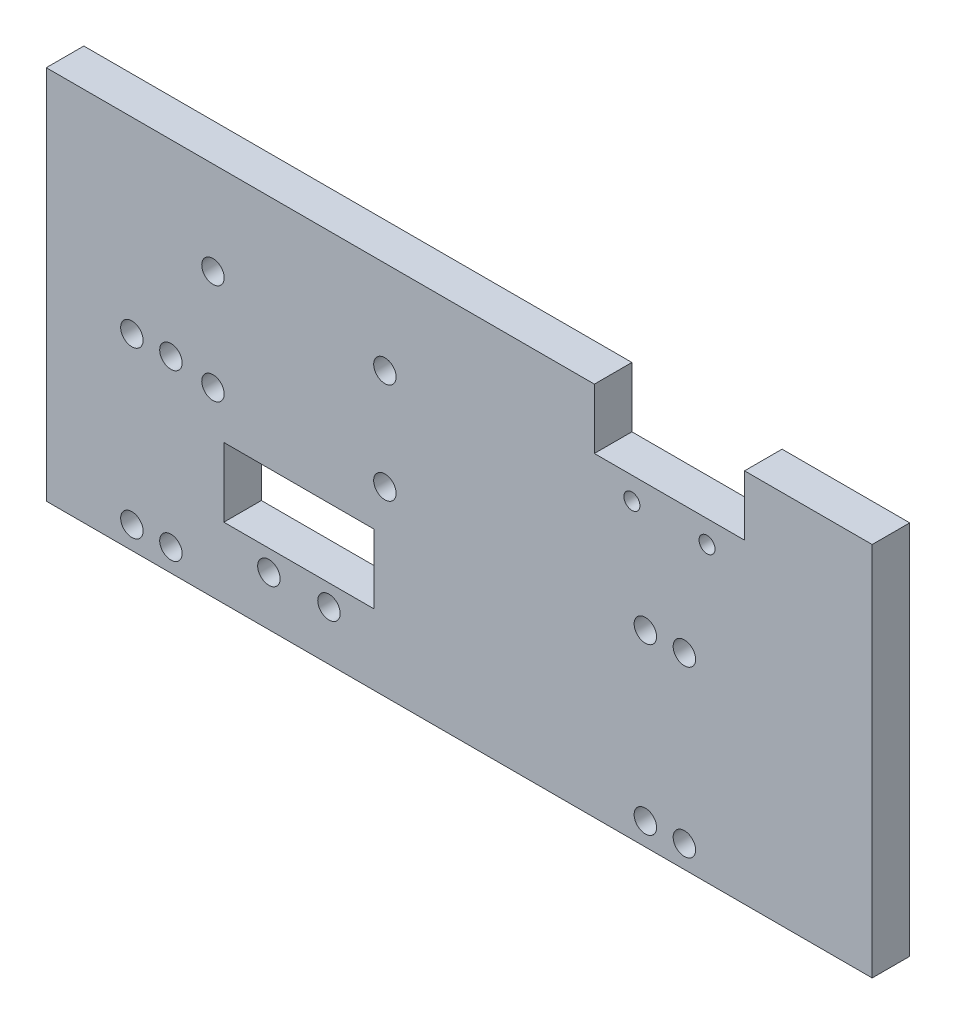
ISO-10303-21;
HEADER;
FILE_DESCRIPTION(('STEP AP214'),'2;1');
FILE_NAME('part.step','',(''),(''),'','','');
FILE_SCHEMA(('AUTOMOTIVE_DESIGN { 1 0 10303 214 1 1 1 1 }'));
ENDSEC;
DATA;
#1=APPLICATION_CONTEXT('core data for automotive mechanical design processes');
#2=APPLICATION_PROTOCOL_DEFINITION('international standard','automotive_design',2000,#1);
#3=PRODUCT_CONTEXT('',#1,'mechanical');
#4=PRODUCT('Part','Part','',(#3));
#5=PRODUCT_RELATED_PRODUCT_CATEGORY('part','',(#4));
#6=PRODUCT_DEFINITION_FORMATION('','',#4);
#7=PRODUCT_DEFINITION_CONTEXT('part definition',#1,'design');
#8=PRODUCT_DEFINITION('design','',#6,#7);
#9=PRODUCT_DEFINITION_SHAPE('','',#8);
#10=(LENGTH_UNIT() NAMED_UNIT(*) SI_UNIT(.MILLI.,.METRE.));
#11=(NAMED_UNIT(*) PLANE_ANGLE_UNIT() SI_UNIT($,.RADIAN.));
#12=(NAMED_UNIT(*) SI_UNIT($,.STERADIAN.) SOLID_ANGLE_UNIT());
#13=UNCERTAINTY_MEASURE_WITH_UNIT(LENGTH_MEASURE(1.E-05),#10,'distance_accuracy_value','');
#14=(GEOMETRIC_REPRESENTATION_CONTEXT(3) GLOBAL_UNCERTAINTY_ASSIGNED_CONTEXT((#13)) GLOBAL_UNIT_ASSIGNED_CONTEXT((#10,
#11,#12)) REPRESENTATION_CONTEXT('',''));
#15=CARTESIAN_POINT('',(0.,0.,0.));
#16=DIRECTION('',(0.,0.,1.));
#17=DIRECTION('',(1.,0.,0.));
#18=AXIS2_PLACEMENT_3D('',#15,#16,#17);
#19=CARTESIAN_POINT('',(127.,31.75,6.35));
#20=DIRECTION('',(0.,-1.,0.));
#21=DIRECTION('',(1.,0.,0.));
#22=AXIS2_PLACEMENT_3D('',#19,#20,#21);
#23=PLANE('',#22);
#24=DIRECTION('',(-1.,0.,0.));
#25=VECTOR('',#24,1.);
#26=CARTESIAN_POINT('',(127.,31.75,6.35));
#27=LINE('',#26,#25);
#28=CARTESIAN_POINT('',(-34.29,31.75,6.35));
#29=VERTEX_POINT('',#28);
#30=CARTESIAN_POINT('',(-127.,31.75,6.35));
#31=VERTEX_POINT('',#30);
#32=EDGE_CURVE('E263',#29,#31,#27,.T.);
#33=ORIENTED_EDGE('',*,*,#32,.F.);
#34=DIRECTION('',(0.,0.,-1.));
#35=VECTOR('',#34,1.);
#36=CARTESIAN_POINT('',(-34.29,31.75,6.35));
#37=LINE('',#36,#35);
#38=CARTESIAN_POINT('',(-34.29,31.75,0.));
#39=VERTEX_POINT('',#38);
#40=EDGE_CURVE('E42',#29,#39,#37,.T.);
#41=ORIENTED_EDGE('',*,*,#40,.T.);
#42=DIRECTION('',(-1.,0.,0.));
#43=VECTOR('',#42,1.);
#44=CARTESIAN_POINT('',(127.,31.75,0.));
#45=LINE('',#44,#43);
#46=CARTESIAN_POINT('',(-127.,31.75,0.));
#47=VERTEX_POINT('',#46);
#48=EDGE_CURVE('E272',#39,#47,#45,.T.);
#49=ORIENTED_EDGE('',*,*,#48,.T.);
#50=DIRECTION('',(0.,0.,-1.));
#51=VECTOR('',#50,1.);
#52=CARTESIAN_POINT('',(-127.,31.75,6.35));
#53=LINE('',#52,#51);
#54=EDGE_CURVE('E266',#31,#47,#53,.T.);
#55=ORIENTED_EDGE('',*,*,#54,.F.);
#56=EDGE_LOOP('',(#33,#41,#49,#55));
#57=FACE_BOUND('',#56,.T.);
#58=ADVANCED_FACE('F33',(#57),#23,.F.);
#59=CARTESIAN_POINT('',(0.,0.,6.35));
#60=DIRECTION('',(0.,0.,1.));
#61=DIRECTION('',(1.,0.,0.));
#62=AXIS2_PLACEMENT_3D('',#59,#60,#61);
#63=PLANE('',#62);
#64=CARTESIAN_POINT('',(-25.6687974823819,0.,6.35));
#65=DIRECTION('',(0.,0.,1.));
#66=DIRECTION('',(1.,0.,0.));
#67=AXIS2_PLACEMENT_3D('',#64,#65,#66);
#68=CIRCLE('',#67,1.89865);
#69=CARTESIAN_POINT('',(-23.7701474823819,0.,6.35));
#70=VERTEX_POINT('',#69);
#71=EDGE_CURVE('E299',#70,#70,#68,.T.);
#72=ORIENTED_EDGE('',*,*,#71,.F.);
#73=EDGE_LOOP('',(#72));
#74=FACE_BOUND('',#73,.T.);
#75=CARTESIAN_POINT('',(-19.0647974823819,0.,6.35));
#76=DIRECTION('',(0.,0.,1.));
#77=DIRECTION('',(1.,0.,0.));
#78=AXIS2_PLACEMENT_3D('',#75,#76,#77);
#79=CIRCLE('',#78,1.89865);
#80=CARTESIAN_POINT('',(-17.1661474823819,0.,6.35));
#81=VERTEX_POINT('',#80);
#82=EDGE_CURVE('E289',#81,#81,#79,.T.);
#83=ORIENTED_EDGE('',*,*,#82,.F.);
#84=EDGE_LOOP('',(#83));
#85=FACE_BOUND('',#84,.T.);
#86=CARTESIAN_POINT('',(-25.6687974823819,-27.94,6.35));
#87=DIRECTION('',(0.,0.,1.));
#88=DIRECTION('',(1.,0.,0.));
#89=AXIS2_PLACEMENT_3D('',#86,#87,#88);
#90=CIRCLE('',#89,1.89865);
#91=CARTESIAN_POINT('',(-23.7701474823819,-27.94,6.35));
#92=VERTEX_POINT('',#91);
#93=EDGE_CURVE('E286',#92,#92,#90,.T.);
#94=ORIENTED_EDGE('',*,*,#93,.F.);
#95=EDGE_LOOP('',(#94));
#96=FACE_BOUND('',#95,.T.);
#97=CARTESIAN_POINT('',(-19.0647974823819,-27.94,6.35));
#98=DIRECTION('',(0.,0.,1.));
#99=DIRECTION('',(1.,0.,0.));
#100=AXIS2_PLACEMENT_3D('',#97,#98,#99);
#101=CIRCLE('',#100,1.89865);
#102=CARTESIAN_POINT('',(-17.1661474823819,-27.94,6.35));
#103=VERTEX_POINT('',#102);
#104=EDGE_CURVE('E285',#103,#103,#101,.T.);
#105=ORIENTED_EDGE('',*,*,#104,.F.);
#106=EDGE_LOOP('',(#105));
#107=FACE_BOUND('',#106,.T.);
#108=CARTESIAN_POINT('',(-27.94,17.78,6.35));
#109=DIRECTION('',(0.,0.,1.));
#110=DIRECTION('',(1.,0.,0.));
#111=AXIS2_PLACEMENT_3D('',#108,#109,#110);
#112=CIRCLE('',#111,1.35254999999999);
#113=CARTESIAN_POINT('',(-26.58745,17.78,6.35));
#114=VERTEX_POINT('',#113);
#115=EDGE_CURVE('E307',#114,#114,#112,.T.);
#116=ORIENTED_EDGE('',*,*,#115,.F.);
#117=EDGE_LOOP('',(#116));
#118=FACE_BOUND('',#117,.T.);
#119=CARTESIAN_POINT('',(-15.24,17.78,6.35));
#120=DIRECTION('',(0.,0.,1.));
#121=DIRECTION('',(1.,0.,0.));
#122=AXIS2_PLACEMENT_3D('',#119,#120,#121);
#123=CIRCLE('',#122,1.35254999999999);
#124=CARTESIAN_POINT('',(-13.88745,17.78,6.35));
#125=VERTEX_POINT('',#124);
#126=EDGE_CURVE('E313',#125,#125,#123,.T.);
#127=ORIENTED_EDGE('',*,*,#126,.F.);
#128=EDGE_LOOP('',(#127));
#129=FACE_BOUND('',#128,.T.);
#130=DIRECTION('',(0.,-1.,0.));
#131=VECTOR('',#130,1.);
#132=CARTESIAN_POINT('',(-34.29,31.75,6.35));
#133=LINE('',#132,#131);
#134=CARTESIAN_POINT('',(-34.29,21.59,6.35));
#135=VERTEX_POINT('',#134);
#136=EDGE_CURVE('E135',#29,#135,#133,.T.);
#137=ORIENTED_EDGE('',*,*,#136,.F.);
#138=ORIENTED_EDGE('',*,*,#32,.T.);
#139=DIRECTION('',(0.,-1.,0.));
#140=VECTOR('',#139,1.);
#141=CARTESIAN_POINT('',(-127.,-31.75,6.35));
#142=LINE('',#141,#140);
#143=CARTESIAN_POINT('',(-127.,-31.75,6.35));
#144=VERTEX_POINT('',#143);
#145=EDGE_CURVE('E256',#31,#144,#142,.T.);
#146=ORIENTED_EDGE('',*,*,#145,.T.);
#147=DIRECTION('',(1.,0.,0.));
#148=VECTOR('',#147,1.);
#149=CARTESIAN_POINT('',(127.,-31.75,6.35));
#150=LINE('',#149,#148);
#151=CARTESIAN_POINT('',(12.7,-31.75,6.35));
#152=VERTEX_POINT('',#151);
#153=EDGE_CURVE('E259',#144,#152,#150,.T.);
#154=ORIENTED_EDGE('',*,*,#153,.T.);
#155=DIRECTION('',(0.,-1.,0.));
#156=VECTOR('',#155,1.);
#157=CARTESIAN_POINT('',(12.7,31.75,6.35));
#158=LINE('',#157,#156);
#159=CARTESIAN_POINT('',(12.7,31.75,6.35));
#160=VERTEX_POINT('',#159);
#161=EDGE_CURVE('E155',#160,#152,#158,.T.);
#162=ORIENTED_EDGE('',*,*,#161,.F.);
#163=CARTESIAN_POINT('',(-8.88999999999998,31.75,6.35));
#164=VERTEX_POINT('',#163);
#165=EDGE_CURVE('E264',#160,#164,#27,.T.);
#166=ORIENTED_EDGE('',*,*,#165,.T.);
#167=DIRECTION('',(0.,1.,0.));
#168=VECTOR('',#167,1.);
#169=CARTESIAN_POINT('',(-8.88999999999997,31.75,6.35));
#170=LINE('',#169,#168);
#171=CARTESIAN_POINT('',(-8.88999999999997,21.59,6.35));
#172=VERTEX_POINT('',#171);
#173=EDGE_CURVE('E50',#172,#164,#170,.T.);
#174=ORIENTED_EDGE('',*,*,#173,.F.);
#175=DIRECTION('',(1.,0.,0.));
#176=VECTOR('',#175,1.);
#177=CARTESIAN_POINT('',(-34.29,21.59,6.35));
#178=LINE('',#177,#176);
#179=EDGE_CURVE('E129',#135,#172,#178,.T.);
#180=ORIENTED_EDGE('',*,*,#179,.F.);
#181=EDGE_LOOP('',(#137,#138,#146,#154,#162,#166,#174,#180));
#182=FACE_BOUND('',#181,.T.);
#183=CARTESIAN_POINT('',(-79.1845,-23.35276,6.35));
#184=DIRECTION('',(0.,0.,1.));
#185=DIRECTION('',(1.,0.,0.));
#186=AXIS2_PLACEMENT_3D('',#183,#184,#185);
#187=CIRCLE('',#186,1.89864999999999);
#188=CARTESIAN_POINT('',(-77.28585,-23.35276,6.35));
#189=VERTEX_POINT('',#188);
#190=EDGE_CURVE('E166',#189,#189,#187,.T.);
#191=ORIENTED_EDGE('',*,*,#190,.F.);
#192=EDGE_LOOP('',(#191));
#193=FACE_BOUND('',#192,.T.);
#194=CARTESIAN_POINT('',(-89.3445,-23.35276,6.35));
#195=DIRECTION('',(0.,0.,1.));
#196=DIRECTION('',(1.,0.,0.));
#197=AXIS2_PLACEMENT_3D('',#194,#195,#196);
#198=CIRCLE('',#197,1.89864999999999);
#199=CARTESIAN_POINT('',(-87.44585,-23.35276,6.35));
#200=VERTEX_POINT('',#199);
#201=EDGE_CURVE('E172',#200,#200,#198,.T.);
#202=ORIENTED_EDGE('',*,*,#201,.F.);
#203=EDGE_LOOP('',(#202));
#204=FACE_BOUND('',#203,.T.);
#205=CARTESIAN_POINT('',(-69.723,16.002,6.35));
#206=DIRECTION('',(0.,0.,1.));
#207=DIRECTION('',(1.,0.,0.));
#208=AXIS2_PLACEMENT_3D('',#205,#206,#207);
#209=CIRCLE('',#208,1.89865);
#210=CARTESIAN_POINT('',(-67.82435,16.002,6.35));
#211=VERTEX_POINT('',#210);
#212=EDGE_CURVE('E178',#211,#211,#209,.T.);
#213=ORIENTED_EDGE('',*,*,#212,.F.);
#214=EDGE_LOOP('',(#213));
#215=FACE_BOUND('',#214,.T.);
#216=CARTESIAN_POINT('',(-98.806,16.002,6.35));
#217=DIRECTION('',(0.,0.,1.));
#218=DIRECTION('',(1.,0.,0.));
#219=AXIS2_PLACEMENT_3D('',#216,#217,#218);
#220=CIRCLE('',#219,1.89865);
#221=CARTESIAN_POINT('',(-96.90735,16.002,6.35));
#222=VERTEX_POINT('',#221);
#223=EDGE_CURVE('E184',#222,#222,#220,.T.);
#224=ORIENTED_EDGE('',*,*,#223,.F.);
#225=EDGE_LOOP('',(#224));
#226=FACE_BOUND('',#225,.T.);
#227=CARTESIAN_POINT('',(-98.806,-1.01600000000002,6.35));
#228=DIRECTION('',(0.,0.,1.));
#229=DIRECTION('',(1.,0.,0.));
#230=AXIS2_PLACEMENT_3D('',#227,#228,#229);
#231=CIRCLE('',#230,1.89865);
#232=CARTESIAN_POINT('',(-96.90735,-1.01600000000002,6.35));
#233=VERTEX_POINT('',#232);
#234=EDGE_CURVE('E222',#233,#233,#231,.T.);
#235=ORIENTED_EDGE('',*,*,#234,.F.);
#236=EDGE_LOOP('',(#235));
#237=FACE_BOUND('',#236,.T.);
#238=CARTESIAN_POINT('',(-69.723,-1.01600000000002,6.35));
#239=DIRECTION('',(0.,0.,1.));
#240=DIRECTION('',(1.,0.,0.));
#241=AXIS2_PLACEMENT_3D('',#238,#239,#240);
#242=CIRCLE('',#241,1.89865);
#243=CARTESIAN_POINT('',(-67.82435,-1.01600000000002,6.35));
#244=VERTEX_POINT('',#243);
#245=EDGE_CURVE('E228',#244,#244,#242,.T.);
#246=ORIENTED_EDGE('',*,*,#245,.F.);
#247=EDGE_LOOP('',(#246));
#248=FACE_BOUND('',#247,.T.);
#249=CARTESIAN_POINT('',(-105.918,0.,6.35));
#250=DIRECTION('',(0.,0.,1.));
#251=DIRECTION('',(1.,0.,0.));
#252=AXIS2_PLACEMENT_3D('',#249,#250,#251);
#253=CIRCLE('',#252,1.89865);
#254=CARTESIAN_POINT('',(-104.01935,0.,6.35));
#255=VERTEX_POINT('',#254);
#256=EDGE_CURVE('E231',#255,#255,#253,.T.);
#257=ORIENTED_EDGE('',*,*,#256,.F.);
#258=EDGE_LOOP('',(#257));
#259=FACE_BOUND('',#258,.T.);
#260=CARTESIAN_POINT('',(-112.522,-27.94,6.35));
#261=DIRECTION('',(0.,0.,1.));
#262=DIRECTION('',(1.,0.,0.));
#263=AXIS2_PLACEMENT_3D('',#260,#261,#262);
#264=CIRCLE('',#263,1.89865);
#265=CARTESIAN_POINT('',(-110.62335,-27.94,6.35));
#266=VERTEX_POINT('',#265);
#267=EDGE_CURVE('E237',#266,#266,#264,.T.);
#268=ORIENTED_EDGE('',*,*,#267,.F.);
#269=EDGE_LOOP('',(#268));
#270=FACE_BOUND('',#269,.T.);
#271=CARTESIAN_POINT('',(-112.522,0.,6.35));
#272=DIRECTION('',(0.,0.,1.));
#273=DIRECTION('',(1.,0.,0.));
#274=AXIS2_PLACEMENT_3D('',#271,#272,#273);
#275=CIRCLE('',#274,1.89865);
#276=CARTESIAN_POINT('',(-110.62335,0.,6.35));
#277=VERTEX_POINT('',#276);
#278=EDGE_CURVE('E243',#277,#277,#275,.T.);
#279=ORIENTED_EDGE('',*,*,#278,.F.);
#280=EDGE_LOOP('',(#279));
#281=FACE_BOUND('',#280,.T.);
#282=CARTESIAN_POINT('',(-105.918,-27.94,6.35));
#283=DIRECTION('',(0.,0.,1.));
#284=DIRECTION('',(1.,0.,0.));
#285=AXIS2_PLACEMENT_3D('',#282,#283,#284);
#286=CIRCLE('',#285,1.89865);
#287=CARTESIAN_POINT('',(-104.01935,-27.94,6.35));
#288=VERTEX_POINT('',#287);
#289=EDGE_CURVE('E249',#288,#288,#286,.T.);
#290=ORIENTED_EDGE('',*,*,#289,.F.);
#291=EDGE_LOOP('',(#290));
#292=FACE_BOUND('',#291,.T.);
#293=DIRECTION('',(0.,1.,0.));
#294=VECTOR('',#293,1.);
#295=CARTESIAN_POINT('',(-71.5645,0.,6.35));
#296=LINE('',#295,#294);
#297=CARTESIAN_POINT('',(-71.5645,-19.812,6.35));
#298=VERTEX_POINT('',#297);
#299=CARTESIAN_POINT('',(-71.5645,-8.12800000000003,6.35));
#300=VERTEX_POINT('',#299);
#301=EDGE_CURVE('E197',#298,#300,#296,.T.);
#302=ORIENTED_EDGE('',*,*,#301,.F.);
#303=DIRECTION('',(1.,0.,0.));
#304=VECTOR('',#303,1.);
#305=CARTESIAN_POINT('',(0.,-19.812,6.35));
#306=LINE('',#305,#304);
#307=CARTESIAN_POINT('',(-96.9645,-19.812,6.35));
#308=VERTEX_POINT('',#307);
#309=EDGE_CURVE('E188',#308,#298,#306,.T.);
#310=ORIENTED_EDGE('',*,*,#309,.F.);
#311=DIRECTION('',(0.,1.,0.));
#312=VECTOR('',#311,1.);
#313=CARTESIAN_POINT('',(-96.9645,0.,6.35));
#314=LINE('',#313,#312);
#315=CARTESIAN_POINT('',(-96.9645,-8.12800000000002,6.35));
#316=VERTEX_POINT('',#315);
#317=EDGE_CURVE('E190',#308,#316,#314,.T.);
#318=ORIENTED_EDGE('',*,*,#317,.T.);
#319=DIRECTION('',(1.,0.,0.));
#320=VECTOR('',#319,1.);
#321=CARTESIAN_POINT('',(0.,-8.12800000000004,6.35));
#322=LINE('',#321,#320);
#323=EDGE_CURVE('E194',#316,#300,#322,.T.);
#324=ORIENTED_EDGE('',*,*,#323,.T.);
#325=EDGE_LOOP('',(#302,#310,#318,#324));
#326=FACE_BOUND('',#325,.T.);
#327=ADVANCED_FACE('F142',(#74,#85,#96,#107,#118,#129,#182,#193,#204,#215,#226,#237,#248,#259,
#270,#281,#292,#326),#63,.T.);
#328=CARTESIAN_POINT('',(0.,0.,0.));
#329=DIRECTION('',(0.,0.,1.));
#330=DIRECTION('',(1.,0.,0.));
#331=AXIS2_PLACEMENT_3D('',#328,#329,#330);
#332=PLANE('',#331);
#333=CARTESIAN_POINT('',(-25.6687974823819,0.,0.));
#334=DIRECTION('',(0.,0.,1.));
#335=DIRECTION('',(1.,0.,0.));
#336=AXIS2_PLACEMENT_3D('',#333,#334,#335);
#337=CIRCLE('',#336,1.89865);
#338=CARTESIAN_POINT('',(-23.7701474823819,0.,0.));
#339=VERTEX_POINT('',#338);
#340=EDGE_CURVE('E37',#339,#339,#337,.T.);
#341=ORIENTED_EDGE('',*,*,#340,.T.);
#342=EDGE_LOOP('',(#341));
#343=FACE_BOUND('',#342,.T.);
#344=CARTESIAN_POINT('',(-19.0647974823819,0.,0.));
#345=DIRECTION('',(0.,0.,1.));
#346=DIRECTION('',(1.,0.,0.));
#347=AXIS2_PLACEMENT_3D('',#344,#345,#346);
#348=CIRCLE('',#347,1.89865);
#349=CARTESIAN_POINT('',(-17.1661474823819,0.,0.));
#350=VERTEX_POINT('',#349);
#351=EDGE_CURVE('E287',#350,#350,#348,.T.);
#352=ORIENTED_EDGE('',*,*,#351,.T.);
#353=EDGE_LOOP('',(#352));
#354=FACE_BOUND('',#353,.T.);
#355=CARTESIAN_POINT('',(-25.6687974823819,-27.94,0.));
#356=DIRECTION('',(0.,0.,1.));
#357=DIRECTION('',(1.,0.,0.));
#358=AXIS2_PLACEMENT_3D('',#355,#356,#357);
#359=CIRCLE('',#358,1.89865);
#360=CARTESIAN_POINT('',(-23.7701474823819,-27.94,0.));
#361=VERTEX_POINT('',#360);
#362=EDGE_CURVE('E283',#361,#361,#359,.T.);
#363=ORIENTED_EDGE('',*,*,#362,.T.);
#364=EDGE_LOOP('',(#363));
#365=FACE_BOUND('',#364,.T.);
#366=CARTESIAN_POINT('',(-19.0647974823819,-27.94,0.));
#367=DIRECTION('',(0.,0.,1.));
#368=DIRECTION('',(1.,0.,0.));
#369=AXIS2_PLACEMENT_3D('',#366,#367,#368);
#370=CIRCLE('',#369,1.89865);
#371=CARTESIAN_POINT('',(-17.1661474823819,-27.94,0.));
#372=VERTEX_POINT('',#371);
#373=EDGE_CURVE('E304',#372,#372,#370,.T.);
#374=ORIENTED_EDGE('',*,*,#373,.T.);
#375=EDGE_LOOP('',(#374));
#376=FACE_BOUND('',#375,.T.);
#377=CARTESIAN_POINT('',(-27.94,17.78,0.));
#378=DIRECTION('',(0.,0.,1.));
#379=DIRECTION('',(1.,0.,0.));
#380=AXIS2_PLACEMENT_3D('',#377,#378,#379);
#381=CIRCLE('',#380,1.35254999999999);
#382=CARTESIAN_POINT('',(-26.58745,17.78,0.));
#383=VERTEX_POINT('',#382);
#384=EDGE_CURVE('E310',#383,#383,#381,.T.);
#385=ORIENTED_EDGE('',*,*,#384,.T.);
#386=EDGE_LOOP('',(#385));
#387=FACE_BOUND('',#386,.T.);
#388=CARTESIAN_POINT('',(-15.24,17.78,0.));
#389=DIRECTION('',(0.,0.,1.));
#390=DIRECTION('',(1.,0.,0.));
#391=AXIS2_PLACEMENT_3D('',#388,#389,#390);
#392=CIRCLE('',#391,1.35254999999999);
#393=CARTESIAN_POINT('',(-13.88745,17.78,0.));
#394=VERTEX_POINT('',#393);
#395=EDGE_CURVE('E140',#394,#394,#392,.T.);
#396=ORIENTED_EDGE('',*,*,#395,.T.);
#397=EDGE_LOOP('',(#396));
#398=FACE_BOUND('',#397,.T.);
#399=ORIENTED_EDGE('',*,*,#48,.F.);
#400=DIRECTION('',(0.,-1.,0.));
#401=VECTOR('',#400,1.);
#402=CARTESIAN_POINT('',(-34.29,0.,0.));
#403=LINE('',#402,#401);
#404=CARTESIAN_POINT('',(-34.29,21.59,0.));
#405=VERTEX_POINT('',#404);
#406=EDGE_CURVE('E153',#39,#405,#403,.T.);
#407=ORIENTED_EDGE('',*,*,#406,.T.);
#408=DIRECTION('',(1.,0.,0.));
#409=VECTOR('',#408,1.);
#410=CARTESIAN_POINT('',(0.,21.59,0.));
#411=LINE('',#410,#409);
#412=CARTESIAN_POINT('',(-8.88999999999997,21.59,0.));
#413=VERTEX_POINT('',#412);
#414=EDGE_CURVE('E11',#405,#413,#411,.T.);
#415=ORIENTED_EDGE('',*,*,#414,.T.);
#416=DIRECTION('',(0.,1.,0.));
#417=VECTOR('',#416,1.);
#418=CARTESIAN_POINT('',(-8.88999999999997,0.,0.));
#419=LINE('',#418,#417);
#420=CARTESIAN_POINT('',(-8.88999999999997,31.75,0.));
#421=VERTEX_POINT('',#420);
#422=EDGE_CURVE('E149',#413,#421,#419,.T.);
#423=ORIENTED_EDGE('',*,*,#422,.T.);
#424=CARTESIAN_POINT('',(12.7,31.75,0.));
#425=VERTEX_POINT('',#424);
#426=EDGE_CURVE('E260',#425,#421,#45,.T.);
#427=ORIENTED_EDGE('',*,*,#426,.F.);
#428=DIRECTION('',(0.,-1.,0.));
#429=VECTOR('',#428,1.);
#430=CARTESIAN_POINT('',(12.7,31.75,0.));
#431=LINE('',#430,#429);
#432=CARTESIAN_POINT('',(12.7,-31.75,0.));
#433=VERTEX_POINT('',#432);
#434=EDGE_CURVE('E58',#425,#433,#431,.T.);
#435=ORIENTED_EDGE('',*,*,#434,.T.);
#436=DIRECTION('',(1.,0.,0.));
#437=VECTOR('',#436,1.);
#438=CARTESIAN_POINT('',(127.,-31.75,0.));
#439=LINE('',#438,#437);
#440=CARTESIAN_POINT('',(-127.,-31.75,0.));
#441=VERTEX_POINT('',#440);
#442=EDGE_CURVE('E269',#441,#433,#439,.T.);
#443=ORIENTED_EDGE('',*,*,#442,.F.);
#444=DIRECTION('',(0.,-1.,0.));
#445=VECTOR('',#444,1.);
#446=CARTESIAN_POINT('',(-127.,-31.75,0.));
#447=LINE('',#446,#445);
#448=EDGE_CURVE('E255',#47,#441,#447,.T.);
#449=ORIENTED_EDGE('',*,*,#448,.F.);
#450=EDGE_LOOP('',(#399,#407,#415,#423,#427,#435,#443,#449));
#451=FACE_BOUND('',#450,.T.);
#452=CARTESIAN_POINT('',(-79.1845,-23.35276,0.));
#453=DIRECTION('',(0.,0.,-1.));
#454=DIRECTION('',(-1.,0.,0.));
#455=AXIS2_PLACEMENT_3D('',#452,#453,#454);
#456=CIRCLE('',#455,1.89864999999999);
#457=CARTESIAN_POINT('',(-81.08315,-23.35276,0.));
#458=VERTEX_POINT('',#457);
#459=EDGE_CURVE('E162',#458,#458,#456,.T.);
#460=ORIENTED_EDGE('',*,*,#459,.F.);
#461=EDGE_LOOP('',(#460));
#462=FACE_BOUND('',#461,.T.);
#463=CARTESIAN_POINT('',(-89.3445,-23.35276,0.));
#464=DIRECTION('',(0.,0.,-1.));
#465=DIRECTION('',(-1.,0.,0.));
#466=AXIS2_PLACEMENT_3D('',#463,#464,#465);
#467=CIRCLE('',#466,1.89864999999999);
#468=CARTESIAN_POINT('',(-91.24315,-23.35276,0.));
#469=VERTEX_POINT('',#468);
#470=EDGE_CURVE('E169',#469,#469,#467,.T.);
#471=ORIENTED_EDGE('',*,*,#470,.F.);
#472=EDGE_LOOP('',(#471));
#473=FACE_BOUND('',#472,.T.);
#474=CARTESIAN_POINT('',(-69.723,16.002,0.));
#475=DIRECTION('',(0.,0.,-1.));
#476=DIRECTION('',(-1.,0.,0.));
#477=AXIS2_PLACEMENT_3D('',#474,#475,#476);
#478=CIRCLE('',#477,1.89865);
#479=CARTESIAN_POINT('',(-71.62165,16.002,0.));
#480=VERTEX_POINT('',#479);
#481=EDGE_CURVE('E175',#480,#480,#478,.T.);
#482=ORIENTED_EDGE('',*,*,#481,.F.);
#483=EDGE_LOOP('',(#482));
#484=FACE_BOUND('',#483,.T.);
#485=CARTESIAN_POINT('',(-98.806,16.002,0.));
#486=DIRECTION('',(0.,0.,-1.));
#487=DIRECTION('',(-1.,0.,0.));
#488=AXIS2_PLACEMENT_3D('',#485,#486,#487);
#489=CIRCLE('',#488,1.89865);
#490=CARTESIAN_POINT('',(-100.70465,16.002,0.));
#491=VERTEX_POINT('',#490);
#492=EDGE_CURVE('E181',#491,#491,#489,.T.);
#493=ORIENTED_EDGE('',*,*,#492,.F.);
#494=EDGE_LOOP('',(#493));
#495=FACE_BOUND('',#494,.T.);
#496=CARTESIAN_POINT('',(-105.918,-27.94,0.));
#497=DIRECTION('',(0.,0.,1.));
#498=DIRECTION('',(1.,0.,0.));
#499=AXIS2_PLACEMENT_3D('',#496,#497,#498);
#500=CIRCLE('',#499,1.89865);
#501=CARTESIAN_POINT('',(-104.01935,-27.94,0.));
#502=VERTEX_POINT('',#501);
#503=EDGE_CURVE('E252',#502,#502,#500,.T.);
#504=ORIENTED_EDGE('',*,*,#503,.T.);
#505=EDGE_LOOP('',(#504));
#506=FACE_BOUND('',#505,.T.);
#507=CARTESIAN_POINT('',(-112.522,0.,0.));
#508=DIRECTION('',(0.,0.,1.));
#509=DIRECTION('',(1.,0.,0.));
#510=AXIS2_PLACEMENT_3D('',#507,#508,#509);
#511=CIRCLE('',#510,1.89865);
#512=CARTESIAN_POINT('',(-110.62335,0.,0.));
#513=VERTEX_POINT('',#512);
#514=EDGE_CURVE('E246',#513,#513,#511,.T.);
#515=ORIENTED_EDGE('',*,*,#514,.T.);
#516=EDGE_LOOP('',(#515));
#517=FACE_BOUND('',#516,.T.);
#518=CARTESIAN_POINT('',(-112.522,-27.94,0.));
#519=DIRECTION('',(0.,0.,1.));
#520=DIRECTION('',(1.,0.,0.));
#521=AXIS2_PLACEMENT_3D('',#518,#519,#520);
#522=CIRCLE('',#521,1.89865);
#523=CARTESIAN_POINT('',(-110.62335,-27.94,0.));
#524=VERTEX_POINT('',#523);
#525=EDGE_CURVE('E240',#524,#524,#522,.T.);
#526=ORIENTED_EDGE('',*,*,#525,.T.);
#527=EDGE_LOOP('',(#526));
#528=FACE_BOUND('',#527,.T.);
#529=CARTESIAN_POINT('',(-105.918,0.,0.));
#530=DIRECTION('',(0.,0.,1.));
#531=DIRECTION('',(1.,0.,0.));
#532=AXIS2_PLACEMENT_3D('',#529,#530,#531);
#533=CIRCLE('',#532,1.89865);
#534=CARTESIAN_POINT('',(-104.01935,0.,0.));
#535=VERTEX_POINT('',#534);
#536=EDGE_CURVE('E234',#535,#535,#533,.T.);
#537=ORIENTED_EDGE('',*,*,#536,.T.);
#538=EDGE_LOOP('',(#537));
#539=FACE_BOUND('',#538,.T.);
#540=CARTESIAN_POINT('',(-69.723,-1.01600000000002,0.));
#541=DIRECTION('',(0.,0.,-1.));
#542=DIRECTION('',(-1.,0.,0.));
#543=AXIS2_PLACEMENT_3D('',#540,#541,#542);
#544=CIRCLE('',#543,1.89865);
#545=CARTESIAN_POINT('',(-71.62165,-1.01600000000002,0.));
#546=VERTEX_POINT('',#545);
#547=EDGE_CURVE('E225',#546,#546,#544,.T.);
#548=ORIENTED_EDGE('',*,*,#547,.F.);
#549=EDGE_LOOP('',(#548));
#550=FACE_BOUND('',#549,.T.);
#551=CARTESIAN_POINT('',(-98.806,-1.01600000000002,0.));
#552=DIRECTION('',(0.,0.,-1.));
#553=DIRECTION('',(-1.,0.,0.));
#554=AXIS2_PLACEMENT_3D('',#551,#552,#553);
#555=CIRCLE('',#554,1.89865);
#556=CARTESIAN_POINT('',(-100.70465,-1.01600000000002,0.));
#557=VERTEX_POINT('',#556);
#558=EDGE_CURVE('E213',#557,#557,#555,.T.);
#559=ORIENTED_EDGE('',*,*,#558,.F.);
#560=EDGE_LOOP('',(#559));
#561=FACE_BOUND('',#560,.T.);
#562=DIRECTION('',(1.,0.,0.));
#563=VECTOR('',#562,1.);
#564=CARTESIAN_POINT('',(0.,-19.812,0.));
#565=LINE('',#564,#563);
#566=CARTESIAN_POINT('',(-96.9645,-19.812,0.));
#567=VERTEX_POINT('',#566);
#568=CARTESIAN_POINT('',(-71.5645,-19.812,0.));
#569=VERTEX_POINT('',#568);
#570=EDGE_CURVE('E187',#567,#569,#565,.T.);
#571=ORIENTED_EDGE('',*,*,#570,.T.);
#572=DIRECTION('',(0.,1.,0.));
#573=VECTOR('',#572,1.);
#574=CARTESIAN_POINT('',(-71.5645,0.,0.));
#575=LINE('',#574,#573);
#576=CARTESIAN_POINT('',(-71.5645,-8.12800000000003,0.));
#577=VERTEX_POINT('',#576);
#578=EDGE_CURVE('E191',#569,#577,#575,.T.);
#579=ORIENTED_EDGE('',*,*,#578,.T.);
#580=DIRECTION('',(1.,0.,0.));
#581=VECTOR('',#580,1.);
#582=CARTESIAN_POINT('',(0.,-8.12800000000004,0.));
#583=LINE('',#582,#581);
#584=CARTESIAN_POINT('',(-96.9645,-8.12800000000002,0.));
#585=VERTEX_POINT('',#584);
#586=EDGE_CURVE('E205',#585,#577,#583,.T.);
#587=ORIENTED_EDGE('',*,*,#586,.F.);
#588=DIRECTION('',(0.,1.,0.));
#589=VECTOR('',#588,1.);
#590=CARTESIAN_POINT('',(-96.9645,0.,0.));
#591=LINE('',#590,#589);
#592=EDGE_CURVE('E202',#567,#585,#591,.T.);
#593=ORIENTED_EDGE('',*,*,#592,.F.);
#594=EDGE_LOOP('',(#571,#579,#587,#593));
#595=FACE_BOUND('',#594,.T.);
#596=ADVANCED_FACE('F318',(#343,#354,#365,#376,#387,#398,#451,#462,#473,#484,#495,#506,#517,
#528,#539,#550,#561,#595),#332,.F.);
#597=CARTESIAN_POINT('',(-127.,-31.75,6.35));
#598=DIRECTION('',(1.,0.,0.));
#599=DIRECTION('',(0.,0.,-1.));
#600=AXIS2_PLACEMENT_3D('',#597,#598,#599);
#601=PLANE('',#600);
#602=ORIENTED_EDGE('',*,*,#448,.T.);
#603=DIRECTION('',(0.,0.,-1.));
#604=VECTOR('',#603,1.);
#605=CARTESIAN_POINT('',(-127.,-31.75,6.35));
#606=LINE('',#605,#604);
#607=EDGE_CURVE('E277',#144,#441,#606,.T.);
#608=ORIENTED_EDGE('',*,*,#607,.F.);
#609=ORIENTED_EDGE('',*,*,#145,.F.);
#610=ORIENTED_EDGE('',*,*,#54,.T.);
#611=EDGE_LOOP('',(#602,#608,#609,#610));
#612=FACE_BOUND('',#611,.T.);
#613=ADVANCED_FACE('F35',(#612),#601,.F.);
#614=CARTESIAN_POINT('',(127.,-31.75,6.35));
#615=DIRECTION('',(0.,1.,0.));
#616=DIRECTION('',(-1.,0.,0.));
#617=AXIS2_PLACEMENT_3D('',#614,#615,#616);
#618=PLANE('',#617);
#619=ORIENTED_EDGE('',*,*,#442,.T.);
#620=DIRECTION('',(0.,0.,1.));
#621=VECTOR('',#620,1.);
#622=CARTESIAN_POINT('',(12.7,-31.75,0.));
#623=LINE('',#622,#621);
#624=EDGE_CURVE('E159',#433,#152,#623,.T.);
#625=ORIENTED_EDGE('',*,*,#624,.T.);
#626=ORIENTED_EDGE('',*,*,#153,.F.);
#627=ORIENTED_EDGE('',*,*,#607,.T.);
#628=EDGE_LOOP('',(#619,#625,#626,#627));
#629=FACE_BOUND('',#628,.T.);
#630=ADVANCED_FACE('F348',(#629),#618,.F.);
#631=ORIENTED_EDGE('',*,*,#426,.T.);
#632=DIRECTION('',(0.,0.,1.));
#633=VECTOR('',#632,1.);
#634=CARTESIAN_POINT('',(-8.88999999999998,31.75,6.35));
#635=LINE('',#634,#633);
#636=EDGE_CURVE('E280',#421,#164,#635,.T.);
#637=ORIENTED_EDGE('',*,*,#636,.T.);
#638=ORIENTED_EDGE('',*,*,#165,.F.);
#639=DIRECTION('',(0.,0.,1.));
#640=VECTOR('',#639,1.);
#641=CARTESIAN_POINT('',(12.7,31.75,0.));
#642=LINE('',#641,#640);
#643=EDGE_CURVE('E157',#425,#160,#642,.T.);
#644=ORIENTED_EDGE('',*,*,#643,.F.);
#645=EDGE_LOOP('',(#631,#637,#638,#644));
#646=FACE_BOUND('',#645,.T.);
#647=ADVANCED_FACE('F338',(#646),#23,.F.);
#648=CARTESIAN_POINT('',(-105.918,-27.94,6.35));
#649=DIRECTION('',(0.,0.,1.));
#650=DIRECTION('',(1.,0.,0.));
#651=AXIS2_PLACEMENT_3D('',#648,#649,#650);
#652=CYLINDRICAL_SURFACE('',#651,1.89865);
#653=ORIENTED_EDGE('',*,*,#503,.F.);
#654=EDGE_LOOP('',(#653));
#655=FACE_BOUND('',#654,.T.);
#656=ORIENTED_EDGE('',*,*,#289,.T.);
#657=EDGE_LOOP('',(#656));
#658=FACE_BOUND('',#657,.T.);
#659=ADVANCED_FACE('F347',(#655,#658),#652,.F.);
#660=CARTESIAN_POINT('',(-112.522,0.,6.35));
#661=DIRECTION('',(0.,0.,1.));
#662=DIRECTION('',(1.,0.,0.));
#663=AXIS2_PLACEMENT_3D('',#660,#661,#662);
#664=CYLINDRICAL_SURFACE('',#663,1.89865);
#665=ORIENTED_EDGE('',*,*,#514,.F.);
#666=EDGE_LOOP('',(#665));
#667=FACE_BOUND('',#666,.T.);
#668=ORIENTED_EDGE('',*,*,#278,.T.);
#669=EDGE_LOOP('',(#668));
#670=FACE_BOUND('',#669,.T.);
#671=ADVANCED_FACE('F354',(#667,#670),#664,.F.);
#672=CARTESIAN_POINT('',(-112.522,-27.94,6.35));
#673=DIRECTION('',(0.,0.,1.));
#674=DIRECTION('',(1.,0.,0.));
#675=AXIS2_PLACEMENT_3D('',#672,#673,#674);
#676=CYLINDRICAL_SURFACE('',#675,1.89865);
#677=ORIENTED_EDGE('',*,*,#525,.F.);
#678=EDGE_LOOP('',(#677));
#679=FACE_BOUND('',#678,.T.);
#680=ORIENTED_EDGE('',*,*,#267,.T.);
#681=EDGE_LOOP('',(#680));
#682=FACE_BOUND('',#681,.T.);
#683=ADVANCED_FACE('F421',(#679,#682),#676,.F.);
#684=CARTESIAN_POINT('',(-105.918,0.,6.35));
#685=DIRECTION('',(0.,0.,1.));
#686=DIRECTION('',(1.,0.,0.));
#687=AXIS2_PLACEMENT_3D('',#684,#685,#686);
#688=CYLINDRICAL_SURFACE('',#687,1.89865);
#689=ORIENTED_EDGE('',*,*,#536,.F.);
#690=EDGE_LOOP('',(#689));
#691=FACE_BOUND('',#690,.T.);
#692=ORIENTED_EDGE('',*,*,#256,.T.);
#693=EDGE_LOOP('',(#692));
#694=FACE_BOUND('',#693,.T.);
#695=ADVANCED_FACE('F417',(#691,#694),#688,.F.);
#696=CARTESIAN_POINT('',(-69.723,-1.01600000000002,0.));
#697=DIRECTION('',(0.,0.,-1.));
#698=DIRECTION('',(-1.,0.,0.));
#699=AXIS2_PLACEMENT_3D('',#696,#697,#698);
#700=CYLINDRICAL_SURFACE('',#699,1.89865);
#701=ORIENTED_EDGE('',*,*,#245,.T.);
#702=EDGE_LOOP('',(#701));
#703=FACE_BOUND('',#702,.T.);
#704=ORIENTED_EDGE('',*,*,#547,.T.);
#705=EDGE_LOOP('',(#704));
#706=FACE_BOUND('',#705,.T.);
#707=ADVANCED_FACE('F413',(#703,#706),#700,.F.);
#708=CARTESIAN_POINT('',(-98.806,-1.01600000000002,0.));
#709=DIRECTION('',(0.,0.,-1.));
#710=DIRECTION('',(-1.,0.,0.));
#711=AXIS2_PLACEMENT_3D('',#708,#709,#710);
#712=CYLINDRICAL_SURFACE('',#711,1.89865);
#713=ORIENTED_EDGE('',*,*,#234,.T.);
#714=EDGE_LOOP('',(#713));
#715=FACE_BOUND('',#714,.T.);
#716=ORIENTED_EDGE('',*,*,#558,.T.);
#717=EDGE_LOOP('',(#716));
#718=FACE_BOUND('',#717,.T.);
#719=ADVANCED_FACE('F409',(#715,#718),#712,.F.);
#720=CARTESIAN_POINT('',(0.,-19.812,6.35));
#721=DIRECTION('',(0.,1.,0.));
#722=DIRECTION('',(-1.,0.,0.));
#723=AXIS2_PLACEMENT_3D('',#720,#721,#722);
#724=PLANE('',#723);
#725=ORIENTED_EDGE('',*,*,#570,.F.);
#726=DIRECTION('',(0.,0.,-1.));
#727=VECTOR('',#726,1.);
#728=CARTESIAN_POINT('',(-96.9645,-19.812,6.35));
#729=LINE('',#728,#727);
#730=EDGE_CURVE('E199',#308,#567,#729,.T.);
#731=ORIENTED_EDGE('',*,*,#730,.F.);
#732=ORIENTED_EDGE('',*,*,#309,.T.);
#733=DIRECTION('',(0.,0.,-1.));
#734=VECTOR('',#733,1.);
#735=CARTESIAN_POINT('',(-71.5645,-19.812,6.35));
#736=LINE('',#735,#734);
#737=EDGE_CURVE('E210',#298,#569,#736,.T.);
#738=ORIENTED_EDGE('',*,*,#737,.T.);
#739=EDGE_LOOP('',(#725,#731,#732,#738));
#740=FACE_BOUND('',#739,.T.);
#741=ADVANCED_FACE('F399',(#740),#724,.T.);
#742=CARTESIAN_POINT('',(-71.5645,0.,6.35));
#743=DIRECTION('',(-1.,0.,0.));
#744=DIRECTION('',(0.,0.,1.));
#745=AXIS2_PLACEMENT_3D('',#742,#743,#744);
#746=PLANE('',#745);
#747=ORIENTED_EDGE('',*,*,#578,.F.);
#748=ORIENTED_EDGE('',*,*,#737,.F.);
#749=ORIENTED_EDGE('',*,*,#301,.T.);
#750=DIRECTION('',(0.,0.,-1.));
#751=VECTOR('',#750,1.);
#752=CARTESIAN_POINT('',(-71.5645,-8.12800000000003,6.35));
#753=LINE('',#752,#751);
#754=EDGE_CURVE('E214',#300,#577,#753,.T.);
#755=ORIENTED_EDGE('',*,*,#754,.T.);
#756=EDGE_LOOP('',(#747,#748,#749,#755));
#757=FACE_BOUND('',#756,.T.);
#758=ADVANCED_FACE('F395',(#757),#746,.T.);
#759=CARTESIAN_POINT('',(0.,-8.12800000000004,6.35));
#760=DIRECTION('',(0.,1.,0.));
#761=DIRECTION('',(-1.,0.,0.));
#762=AXIS2_PLACEMENT_3D('',#759,#760,#761);
#763=PLANE('',#762);
#764=ORIENTED_EDGE('',*,*,#586,.T.);
#765=ORIENTED_EDGE('',*,*,#754,.F.);
#766=ORIENTED_EDGE('',*,*,#323,.F.);
#767=DIRECTION('',(0.,0.,-1.));
#768=VECTOR('',#767,1.);
#769=CARTESIAN_POINT('',(-96.9645,-8.12800000000002,6.35));
#770=LINE('',#769,#768);
#771=EDGE_CURVE('E216',#316,#585,#770,.T.);
#772=ORIENTED_EDGE('',*,*,#771,.T.);
#773=EDGE_LOOP('',(#764,#765,#766,#772));
#774=FACE_BOUND('',#773,.T.);
#775=ADVANCED_FACE('F398',(#774),#763,.F.);
#776=CARTESIAN_POINT('',(-96.9645,0.,6.35));
#777=DIRECTION('',(-1.,0.,0.));
#778=DIRECTION('',(0.,0.,1.));
#779=AXIS2_PLACEMENT_3D('',#776,#777,#778);
#780=PLANE('',#779);
#781=ORIENTED_EDGE('',*,*,#592,.T.);
#782=ORIENTED_EDGE('',*,*,#771,.F.);
#783=ORIENTED_EDGE('',*,*,#317,.F.);
#784=ORIENTED_EDGE('',*,*,#730,.T.);
#785=EDGE_LOOP('',(#781,#782,#783,#784));
#786=FACE_BOUND('',#785,.T.);
#787=ADVANCED_FACE('F393',(#786),#780,.F.);
#788=CARTESIAN_POINT('',(-98.806,16.002,0.));
#789=DIRECTION('',(0.,0.,-1.));
#790=DIRECTION('',(-1.,0.,0.));
#791=AXIS2_PLACEMENT_3D('',#788,#789,#790);
#792=CYLINDRICAL_SURFACE('',#791,1.89865);
#793=ORIENTED_EDGE('',*,*,#223,.T.);
#794=EDGE_LOOP('',(#793));
#795=FACE_BOUND('',#794,.T.);
#796=ORIENTED_EDGE('',*,*,#492,.T.);
#797=EDGE_LOOP('',(#796));
#798=FACE_BOUND('',#797,.T.);
#799=ADVANCED_FACE('F389',(#795,#798),#792,.F.);
#800=CARTESIAN_POINT('',(-69.723,16.002,0.));
#801=DIRECTION('',(0.,0.,-1.));
#802=DIRECTION('',(-1.,0.,0.));
#803=AXIS2_PLACEMENT_3D('',#800,#801,#802);
#804=CYLINDRICAL_SURFACE('',#803,1.89865);
#805=ORIENTED_EDGE('',*,*,#212,.T.);
#806=EDGE_LOOP('',(#805));
#807=FACE_BOUND('',#806,.T.);
#808=ORIENTED_EDGE('',*,*,#481,.T.);
#809=EDGE_LOOP('',(#808));
#810=FACE_BOUND('',#809,.T.);
#811=ADVANCED_FACE('F385',(#807,#810),#804,.F.);
#812=CARTESIAN_POINT('',(-89.3445,-23.35276,0.));
#813=DIRECTION('',(0.,0.,-1.));
#814=DIRECTION('',(-1.,0.,0.));
#815=AXIS2_PLACEMENT_3D('',#812,#813,#814);
#816=CYLINDRICAL_SURFACE('',#815,1.89864999999999);
#817=ORIENTED_EDGE('',*,*,#201,.T.);
#818=EDGE_LOOP('',(#817));
#819=FACE_BOUND('',#818,.T.);
#820=ORIENTED_EDGE('',*,*,#470,.T.);
#821=EDGE_LOOP('',(#820));
#822=FACE_BOUND('',#821,.T.);
#823=ADVANCED_FACE('F378',(#819,#822),#816,.F.);
#824=CARTESIAN_POINT('',(-79.1845,-23.35276,0.));
#825=DIRECTION('',(0.,0.,-1.));
#826=DIRECTION('',(-1.,0.,0.));
#827=AXIS2_PLACEMENT_3D('',#824,#825,#826);
#828=CYLINDRICAL_SURFACE('',#827,1.89864999999999);
#829=ORIENTED_EDGE('',*,*,#190,.T.);
#830=EDGE_LOOP('',(#829));
#831=FACE_BOUND('',#830,.T.);
#832=ORIENTED_EDGE('',*,*,#459,.T.);
#833=EDGE_LOOP('',(#832));
#834=FACE_BOUND('',#833,.T.);
#835=ADVANCED_FACE('F371',(#831,#834),#828,.F.);
#836=CARTESIAN_POINT('',(12.7,31.75,0.));
#837=DIRECTION('',(-1.,0.,0.));
#838=DIRECTION('',(0.,-1.,0.));
#839=AXIS2_PLACEMENT_3D('',#836,#837,#838);
#840=PLANE('',#839);
#841=ORIENTED_EDGE('',*,*,#161,.T.);
#842=ORIENTED_EDGE('',*,*,#624,.F.);
#843=ORIENTED_EDGE('',*,*,#434,.F.);
#844=ORIENTED_EDGE('',*,*,#643,.T.);
#845=EDGE_LOOP('',(#841,#842,#843,#844));
#846=FACE_BOUND('',#845,.T.);
#847=ADVANCED_FACE('F369',(#846),#840,.F.);
#848=CARTESIAN_POINT('',(-34.29,21.59,-26.67));
#849=DIRECTION('',(0.,-1.,0.));
#850=DIRECTION('',(0.,0.,-1.));
#851=AXIS2_PLACEMENT_3D('',#848,#849,#850);
#852=PLANE('',#851);
#853=DIRECTION('',(0.,0.,1.));
#854=VECTOR('',#853,1.);
#855=CARTESIAN_POINT('',(-34.29,21.59,-26.67));
#856=LINE('',#855,#854);
#857=EDGE_CURVE('E124',#405,#135,#856,.T.);
#858=ORIENTED_EDGE('',*,*,#857,.T.);
#859=ORIENTED_EDGE('',*,*,#179,.T.);
#860=DIRECTION('',(0.,0.,1.));
#861=VECTOR('',#860,1.);
#862=CARTESIAN_POINT('',(-8.88999999999997,21.59,-26.67));
#863=LINE('',#862,#861);
#864=EDGE_CURVE('E132',#413,#172,#863,.T.);
#865=ORIENTED_EDGE('',*,*,#864,.F.);
#866=ORIENTED_EDGE('',*,*,#414,.F.);
#867=EDGE_LOOP('',(#858,#859,#865,#866));
#868=FACE_BOUND('',#867,.T.);
#869=ADVANCED_FACE('F126',(#868),#852,.F.);
#870=CARTESIAN_POINT('',(-34.29,31.75,-26.67));
#871=DIRECTION('',(-1.,0.,0.));
#872=DIRECTION('',(0.,0.,1.));
#873=AXIS2_PLACEMENT_3D('',#870,#871,#872);
#874=PLANE('',#873);
#875=ORIENTED_EDGE('',*,*,#40,.F.);
#876=ORIENTED_EDGE('',*,*,#136,.T.);
#877=ORIENTED_EDGE('',*,*,#857,.F.);
#878=ORIENTED_EDGE('',*,*,#406,.F.);
#879=EDGE_LOOP('',(#875,#876,#877,#878));
#880=FACE_BOUND('',#879,.T.);
#881=ADVANCED_FACE('F136',(#880),#874,.F.);
#882=CARTESIAN_POINT('',(-8.88999999999997,31.75,-26.67));
#883=DIRECTION('',(1.,0.,0.));
#884=DIRECTION('',(0.,0.,-1.));
#885=AXIS2_PLACEMENT_3D('',#882,#883,#884);
#886=PLANE('',#885);
#887=ORIENTED_EDGE('',*,*,#864,.T.);
#888=ORIENTED_EDGE('',*,*,#173,.T.);
#889=ORIENTED_EDGE('',*,*,#636,.F.);
#890=ORIENTED_EDGE('',*,*,#422,.F.);
#891=EDGE_LOOP('',(#887,#888,#889,#890));
#892=FACE_BOUND('',#891,.T.);
#893=ADVANCED_FACE('F324',(#892),#886,.F.);
#894=CARTESIAN_POINT('',(-15.24,17.78,6.35));
#895=DIRECTION('',(0.,0.,1.));
#896=DIRECTION('',(1.,0.,0.));
#897=AXIS2_PLACEMENT_3D('',#894,#895,#896);
#898=CYLINDRICAL_SURFACE('',#897,1.35254999999999);
#899=ORIENTED_EDGE('',*,*,#126,.T.);
#900=EDGE_LOOP('',(#899));
#901=FACE_BOUND('',#900,.T.);
#902=ORIENTED_EDGE('',*,*,#395,.F.);
#903=EDGE_LOOP('',(#902));
#904=FACE_BOUND('',#903,.T.);
#905=ADVANCED_FACE('F321',(#901,#904),#898,.F.);
#906=CARTESIAN_POINT('',(-27.94,17.78,6.35));
#907=DIRECTION('',(0.,0.,1.));
#908=DIRECTION('',(1.,0.,0.));
#909=AXIS2_PLACEMENT_3D('',#906,#907,#908);
#910=CYLINDRICAL_SURFACE('',#909,1.35254999999999);
#911=ORIENTED_EDGE('',*,*,#115,.T.);
#912=EDGE_LOOP('',(#911));
#913=FACE_BOUND('',#912,.T.);
#914=ORIENTED_EDGE('',*,*,#384,.F.);
#915=EDGE_LOOP('',(#914));
#916=FACE_BOUND('',#915,.T.);
#917=ADVANCED_FACE('F323',(#913,#916),#910,.F.);
#918=CARTESIAN_POINT('',(-19.0647974823819,-27.94,6.35));
#919=DIRECTION('',(0.,0.,1.));
#920=DIRECTION('',(1.,0.,0.));
#921=AXIS2_PLACEMENT_3D('',#918,#919,#920);
#922=CYLINDRICAL_SURFACE('',#921,1.89865);
#923=ORIENTED_EDGE('',*,*,#104,.T.);
#924=EDGE_LOOP('',(#923));
#925=FACE_BOUND('',#924,.T.);
#926=ORIENTED_EDGE('',*,*,#373,.F.);
#927=EDGE_LOOP('',(#926));
#928=FACE_BOUND('',#927,.T.);
#929=ADVANCED_FACE('F331',(#925,#928),#922,.F.);
#930=CARTESIAN_POINT('',(-25.6687974823819,-27.94,6.35));
#931=DIRECTION('',(0.,0.,1.));
#932=DIRECTION('',(1.,0.,0.));
#933=AXIS2_PLACEMENT_3D('',#930,#931,#932);
#934=CYLINDRICAL_SURFACE('',#933,1.89865);
#935=ORIENTED_EDGE('',*,*,#93,.T.);
#936=EDGE_LOOP('',(#935));
#937=FACE_BOUND('',#936,.T.);
#938=ORIENTED_EDGE('',*,*,#362,.F.);
#939=EDGE_LOOP('',(#938));
#940=FACE_BOUND('',#939,.T.);
#941=ADVANCED_FACE('F444',(#937,#940),#934,.F.);
#942=CARTESIAN_POINT('',(-19.0647974823819,0.,6.35));
#943=DIRECTION('',(0.,0.,1.));
#944=DIRECTION('',(1.,0.,0.));
#945=AXIS2_PLACEMENT_3D('',#942,#943,#944);
#946=CYLINDRICAL_SURFACE('',#945,1.89865);
#947=ORIENTED_EDGE('',*,*,#82,.T.);
#948=EDGE_LOOP('',(#947));
#949=FACE_BOUND('',#948,.T.);
#950=ORIENTED_EDGE('',*,*,#351,.F.);
#951=EDGE_LOOP('',(#950));
#952=FACE_BOUND('',#951,.T.);
#953=ADVANCED_FACE('F449',(#949,#952),#946,.F.);
#954=CARTESIAN_POINT('',(-25.6687974823819,0.,6.35));
#955=DIRECTION('',(0.,0.,1.));
#956=DIRECTION('',(1.,0.,0.));
#957=AXIS2_PLACEMENT_3D('',#954,#955,#956);
#958=CYLINDRICAL_SURFACE('',#957,1.89865);
#959=ORIENTED_EDGE('',*,*,#71,.T.);
#960=EDGE_LOOP('',(#959));
#961=FACE_BOUND('',#960,.T.);
#962=ORIENTED_EDGE('',*,*,#340,.F.);
#963=EDGE_LOOP('',(#962));
#964=FACE_BOUND('',#963,.T.);
#965=ADVANCED_FACE('F455',(#961,#964),#958,.F.);
#966=CLOSED_SHELL('',(#58,#327,#596,#613,#630,#647,#659,#671,#683,#695,#707,#719,#741,#758,#775,
#787,#799,#811,#823,#835,#847,#869,#881,#893,#905,#917,#929,#941,#953,#965));
#967=MANIFOLD_SOLID_BREP('B2',#966);
#968=ADVANCED_BREP_SHAPE_REPRESENTATION('',(#18,#967),#14);
#969=SHAPE_DEFINITION_REPRESENTATION(#9,#968);
ENDSEC;
END-ISO-10303-21;
